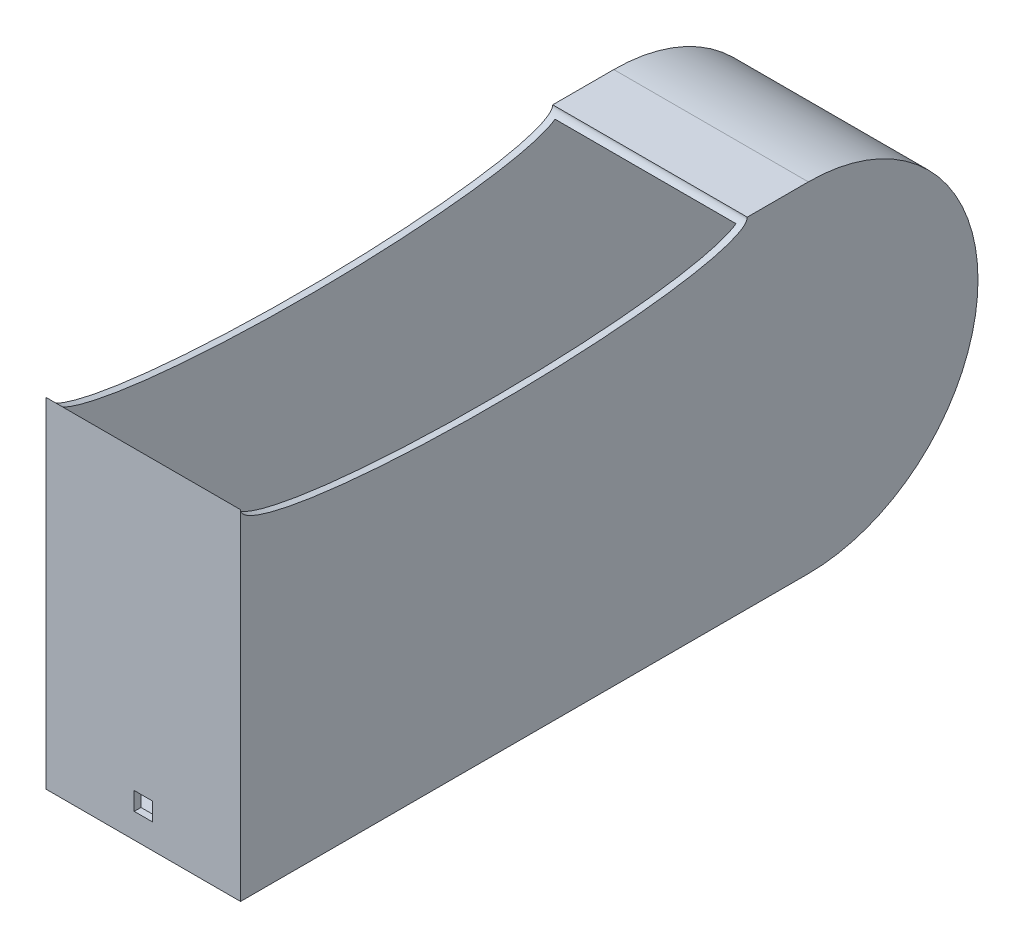
ISO-10303-21;
HEADER;
FILE_DESCRIPTION(('STEP AP214'),'2;1');
FILE_NAME('part.step','',(''),(''),'','','');
FILE_SCHEMA(('AUTOMOTIVE_DESIGN { 1 0 10303 214 1 1 1 1 }'));
ENDSEC;
DATA;
#1=APPLICATION_CONTEXT('core data for automotive mechanical design processes');
#2=APPLICATION_PROTOCOL_DEFINITION('international standard','automotive_design',2000,#1);
#3=PRODUCT_CONTEXT('',#1,'mechanical');
#4=PRODUCT('Part','Part','',(#3));
#5=PRODUCT_RELATED_PRODUCT_CATEGORY('part','',(#4));
#6=PRODUCT_DEFINITION_FORMATION('','',#4);
#7=PRODUCT_DEFINITION_CONTEXT('part definition',#1,'design');
#8=PRODUCT_DEFINITION('design','',#6,#7);
#9=PRODUCT_DEFINITION_SHAPE('','',#8);
#10=(LENGTH_UNIT() NAMED_UNIT(*) SI_UNIT(.MILLI.,.METRE.));
#11=(NAMED_UNIT(*) PLANE_ANGLE_UNIT() SI_UNIT($,.RADIAN.));
#12=(NAMED_UNIT(*) SI_UNIT($,.STERADIAN.) SOLID_ANGLE_UNIT());
#13=UNCERTAINTY_MEASURE_WITH_UNIT(LENGTH_MEASURE(1.E-05),#10,'distance_accuracy_value','');
#14=(GEOMETRIC_REPRESENTATION_CONTEXT(3) GLOBAL_UNCERTAINTY_ASSIGNED_CONTEXT((#13)) GLOBAL_UNIT_ASSIGNED_CONTEXT((#10,
#11,#12)) REPRESENTATION_CONTEXT('',''));
#15=CARTESIAN_POINT('',(0.,0.,0.));
#16=DIRECTION('',(0.,0.,1.));
#17=DIRECTION('',(1.,0.,0.));
#18=AXIS2_PLACEMENT_3D('',#15,#16,#17);
#19=CARTESIAN_POINT('',(-63.5,114.3,0.));
#20=DIRECTION('',(1.,0.,0.));
#21=DIRECTION('',(0.,0.,-1.));
#22=AXIS2_PLACEMENT_3D('',#19,#20,#21);
#23=CYLINDRICAL_SURFACE('',#22,119.0625);
#24=DIRECTION('',(1.,0.,0.));
#25=VECTOR('',#24,1.);
#26=CARTESIAN_POINT('',(-63.5,233.3625,0.));
#27=LINE('',#26,#25);
#28=CARTESIAN_POINT('',(-68.2625,233.3625,0.));
#29=VERTEX_POINT('',#28);
#30=CARTESIAN_POINT('',(68.2625,233.3625,0.));
#31=VERTEX_POINT('',#30);
#32=EDGE_CURVE('E151',#29,#31,#27,.T.);
#33=ORIENTED_EDGE('',*,*,#32,.T.);
#34=CARTESIAN_POINT('',(68.2625,114.3,0.));
#35=DIRECTION('',(1.,0.,0.));
#36=DIRECTION('',(0.,0.,-1.));
#37=AXIS2_PLACEMENT_3D('',#34,#35,#36);
#38=CIRCLE('',#37,119.0625);
#39=CARTESIAN_POINT('',(68.2625,-4.76249999999989,0.));
#40=VERTEX_POINT('',#39);
#41=EDGE_CURVE('E172',#40,#31,#38,.T.);
#42=ORIENTED_EDGE('',*,*,#41,.F.);
#43=DIRECTION('',(1.,0.,0.));
#44=VECTOR('',#43,1.);
#45=CARTESIAN_POINT('',(-63.5,-4.7625,0.));
#46=LINE('',#45,#44);
#47=CARTESIAN_POINT('',(-68.2625,-4.76249999999989,0.));
#48=VERTEX_POINT('',#47);
#49=EDGE_CURVE('E45',#48,#40,#46,.T.);
#50=ORIENTED_EDGE('',*,*,#49,.F.);
#51=CARTESIAN_POINT('',(-68.2625,114.3,0.));
#52=DIRECTION('',(1.,0.,0.));
#53=DIRECTION('',(0.,0.,-1.));
#54=AXIS2_PLACEMENT_3D('',#51,#52,#53);
#55=CIRCLE('',#54,119.0625);
#56=EDGE_CURVE('E159',#48,#29,#55,.T.);
#57=ORIENTED_EDGE('',*,*,#56,.T.);
#58=EDGE_LOOP('',(#33,#42,#50,#57));
#59=FACE_BOUND('',#58,.T.);
#60=ADVANCED_FACE('F38',(#59),#23,.T.);
#61=CARTESIAN_POINT('',(-63.5,-4.7625,0.));
#62=DIRECTION('',(0.,-1.,0.));
#63=DIRECTION('',(0.,0.,-1.));
#64=AXIS2_PLACEMENT_3D('',#61,#62,#63);
#65=PLANE('',#64);
#66=ORIENTED_EDGE('',*,*,#49,.T.);
#67=DIRECTION('',(0.,0.,-1.));
#68=VECTOR('',#67,1.);
#69=CARTESIAN_POINT('',(68.2625,-4.76249999999989,398.4625));
#70=LINE('',#69,#68);
#71=CARTESIAN_POINT('',(68.2625,-4.76249999999989,398.4625));
#72=VERTEX_POINT('',#71);
#73=EDGE_CURVE('E169',#72,#40,#70,.T.);
#74=ORIENTED_EDGE('',*,*,#73,.F.);
#75=DIRECTION('',(1.,0.,0.));
#76=VECTOR('',#75,1.);
#77=CARTESIAN_POINT('',(-63.5,-4.76250000000005,398.4625));
#78=LINE('',#77,#76);
#79=CARTESIAN_POINT('',(-68.2625,-4.76249999999989,398.4625));
#80=VERTEX_POINT('',#79);
#81=EDGE_CURVE('E150',#80,#72,#78,.T.);
#82=ORIENTED_EDGE('',*,*,#81,.F.);
#83=DIRECTION('',(0.,0.,-1.));
#84=VECTOR('',#83,1.);
#85=CARTESIAN_POINT('',(-68.2625,-4.76249999999989,398.4625));
#86=LINE('',#85,#84);
#87=EDGE_CURVE('E156',#80,#48,#86,.T.);
#88=ORIENTED_EDGE('',*,*,#87,.T.);
#89=EDGE_LOOP('',(#66,#74,#82,#88));
#90=FACE_BOUND('',#89,.T.);
#91=ADVANCED_FACE('F250',(#90),#65,.T.);
#92=CARTESIAN_POINT('',(-63.5,-4.76250000000005,398.4625));
#93=DIRECTION('',(0.,0.,1.));
#94=DIRECTION('',(1.,0.,0.));
#95=AXIS2_PLACEMENT_3D('',#92,#93,#94);
#96=PLANE('',#95);
#97=DIRECTION('',(1.,0.,0.));
#98=VECTOR('',#97,1.);
#99=CARTESIAN_POINT('',(-6.35,12.7,398.4625));
#100=LINE('',#99,#98);
#101=CARTESIAN_POINT('',(-6.35,12.7,398.4625));
#102=VERTEX_POINT('',#101);
#103=CARTESIAN_POINT('',(6.35,12.7,398.4625));
#104=VERTEX_POINT('',#103);
#105=EDGE_CURVE('E187',#102,#104,#100,.T.);
#106=ORIENTED_EDGE('',*,*,#105,.F.);
#107=DIRECTION('',(0.,-1.,0.));
#108=VECTOR('',#107,1.);
#109=CARTESIAN_POINT('',(-6.35,25.4,398.4625));
#110=LINE('',#109,#108);
#111=CARTESIAN_POINT('',(-6.35,25.4,398.4625));
#112=VERTEX_POINT('',#111);
#113=EDGE_CURVE('E190',#112,#102,#110,.T.);
#114=ORIENTED_EDGE('',*,*,#113,.F.);
#115=DIRECTION('',(-1.,0.,0.));
#116=VECTOR('',#115,1.);
#117=CARTESIAN_POINT('',(-6.35,25.4,398.4625));
#118=LINE('',#117,#116);
#119=CARTESIAN_POINT('',(6.35,25.4,398.4625));
#120=VERTEX_POINT('',#119);
#121=EDGE_CURVE('E181',#120,#112,#118,.T.);
#122=ORIENTED_EDGE('',*,*,#121,.F.);
#123=DIRECTION('',(0.,1.,0.));
#124=VECTOR('',#123,1.);
#125=CARTESIAN_POINT('',(6.35,25.4,398.4625));
#126=LINE('',#125,#124);
#127=EDGE_CURVE('E184',#104,#120,#126,.T.);
#128=ORIENTED_EDGE('',*,*,#127,.F.);
#129=EDGE_LOOP('',(#106,#114,#122,#128));
#130=FACE_BOUND('',#129,.T.);
#131=ORIENTED_EDGE('',*,*,#81,.T.);
#132=DIRECTION('',(0.,-1.,0.));
#133=VECTOR('',#132,1.);
#134=CARTESIAN_POINT('',(68.2625,233.3625,398.4625));
#135=LINE('',#134,#133);
#136=CARTESIAN_POINT('',(68.2625,233.3625,398.4625));
#137=VERTEX_POINT('',#136);
#138=EDGE_CURVE('E149',#137,#72,#135,.T.);
#139=ORIENTED_EDGE('',*,*,#138,.F.);
#140=DIRECTION('',(1.,0.,0.));
#141=VECTOR('',#140,1.);
#142=CARTESIAN_POINT('',(-63.5,233.3625,398.4625));
#143=LINE('',#142,#141);
#144=CARTESIAN_POINT('',(-68.2625,233.3625,398.4625));
#145=VERTEX_POINT('',#144);
#146=EDGE_CURVE('E136',#145,#137,#143,.T.);
#147=ORIENTED_EDGE('',*,*,#146,.F.);
#148=DIRECTION('',(0.,-1.,0.));
#149=VECTOR('',#148,1.);
#150=CARTESIAN_POINT('',(-68.2625,233.3625,398.4625));
#151=LINE('',#150,#149);
#152=EDGE_CURVE('E146',#145,#80,#151,.T.);
#153=ORIENTED_EDGE('',*,*,#152,.T.);
#154=EDGE_LOOP('',(#131,#139,#147,#153));
#155=FACE_BOUND('',#154,.T.);
#156=ADVANCED_FACE('F145',(#130,#155),#96,.T.);
#157=CARTESIAN_POINT('',(-63.5,233.3625,398.4625));
#158=DIRECTION('',(0.,1.,0.));
#159=DIRECTION('',(0.,0.,1.));
#160=AXIS2_PLACEMENT_3D('',#157,#158,#159);
#161=PLANE('',#160);
#162=DIRECTION('',(1.,0.,0.));
#163=VECTOR('',#162,1.);
#164=CARTESIAN_POINT('',(-68.2625,233.3625,42.8625));
#165=LINE('',#164,#163);
#166=CARTESIAN_POINT('',(68.2625,233.3625,42.8625));
#167=VERTEX_POINT('',#166);
#168=CARTESIAN_POINT('',(-68.2625,233.3625,42.8625000000001));
#169=VERTEX_POINT('',#168);
#170=EDGE_CURVE('E59',#167,#169,#165,.F.);
#171=ORIENTED_EDGE('',*,*,#170,.F.);
#172=DIRECTION('',(0.,0.,1.));
#173=VECTOR('',#172,1.);
#174=CARTESIAN_POINT('',(68.2625,233.3625,398.4625));
#175=LINE('',#174,#173);
#176=EDGE_CURVE('E175',#31,#167,#175,.T.);
#177=ORIENTED_EDGE('',*,*,#176,.F.);
#178=ORIENTED_EDGE('',*,*,#32,.F.);
#179=DIRECTION('',(0.,0.,1.));
#180=VECTOR('',#179,1.);
#181=CARTESIAN_POINT('',(-68.2625,233.3625,398.4625));
#182=LINE('',#181,#180);
#183=EDGE_CURVE('E157',#29,#169,#182,.T.);
#184=ORIENTED_EDGE('',*,*,#183,.T.);
#185=EDGE_LOOP('',(#171,#177,#178,#184));
#186=FACE_BOUND('',#185,.T.);
#187=ADVANCED_FACE('F248',(#186),#161,.T.);
#188=CARTESIAN_POINT('',(-63.5,114.3,0.));
#189=DIRECTION('',(1.,0.,0.));
#190=DIRECTION('',(0.,0.,-1.));
#191=AXIS2_PLACEMENT_3D('',#188,#189,#190);
#192=CYLINDRICAL_SURFACE('',#191,114.3);
#193=DIRECTION('',(1.,0.,0.));
#194=VECTOR('',#193,1.);
#195=CARTESIAN_POINT('',(-63.5,0.,0.));
#196=LINE('',#195,#194);
#197=CARTESIAN_POINT('',(-63.5,0.,0.));
#198=VERTEX_POINT('',#197);
#199=CARTESIAN_POINT('',(63.5,0.,0.));
#200=VERTEX_POINT('',#199);
#201=EDGE_CURVE('E232',#198,#200,#196,.T.);
#202=ORIENTED_EDGE('',*,*,#201,.T.);
#203=CARTESIAN_POINT('',(63.5,114.3,0.));
#204=DIRECTION('',(1.,0.,0.));
#205=DIRECTION('',(0.,0.,-1.));
#206=AXIS2_PLACEMENT_3D('',#203,#204,#205);
#207=CIRCLE('',#206,114.3);
#208=CARTESIAN_POINT('',(63.5,228.6,0.));
#209=VERTEX_POINT('',#208);
#210=EDGE_CURVE('E209',#200,#209,#207,.T.);
#211=ORIENTED_EDGE('',*,*,#210,.T.);
#212=DIRECTION('',(1.,0.,0.));
#213=VECTOR('',#212,1.);
#214=CARTESIAN_POINT('',(-63.5,228.6,0.));
#215=LINE('',#214,#213);
#216=CARTESIAN_POINT('',(-63.5,228.6,0.));
#217=VERTEX_POINT('',#216);
#218=EDGE_CURVE('E231',#217,#209,#215,.T.);
#219=ORIENTED_EDGE('',*,*,#218,.F.);
#220=CARTESIAN_POINT('',(-63.5,114.3,0.));
#221=DIRECTION('',(1.,0.,0.));
#222=DIRECTION('',(0.,0.,-1.));
#223=AXIS2_PLACEMENT_3D('',#220,#221,#222);
#224=CIRCLE('',#223,114.3);
#225=EDGE_CURVE('E220',#198,#217,#224,.T.);
#226=ORIENTED_EDGE('',*,*,#225,.F.);
#227=EDGE_LOOP('',(#202,#211,#219,#226));
#228=FACE_BOUND('',#227,.T.);
#229=ADVANCED_FACE('F295',(#228),#192,.F.);
#230=CARTESIAN_POINT('',(-63.5,0.,0.));
#231=DIRECTION('',(0.,-1.,0.));
#232=DIRECTION('',(0.,0.,-1.));
#233=AXIS2_PLACEMENT_3D('',#230,#231,#232);
#234=PLANE('',#233);
#235=DIRECTION('',(1.,0.,0.));
#236=VECTOR('',#235,1.);
#237=CARTESIAN_POINT('',(-63.5,0.,393.7));
#238=LINE('',#237,#236);
#239=CARTESIAN_POINT('',(-63.5,0.,393.7));
#240=VERTEX_POINT('',#239);
#241=CARTESIAN_POINT('',(63.5,0.,393.7));
#242=VERTEX_POINT('',#241);
#243=EDGE_CURVE('E235',#240,#242,#238,.T.);
#244=ORIENTED_EDGE('',*,*,#243,.T.);
#245=DIRECTION('',(0.,0.,-1.));
#246=VECTOR('',#245,1.);
#247=CARTESIAN_POINT('',(63.5,0.,0.));
#248=LINE('',#247,#246);
#249=EDGE_CURVE('E217',#242,#200,#248,.T.);
#250=ORIENTED_EDGE('',*,*,#249,.T.);
#251=ORIENTED_EDGE('',*,*,#201,.F.);
#252=DIRECTION('',(0.,0.,-1.));
#253=VECTOR('',#252,1.);
#254=CARTESIAN_POINT('',(-63.5,0.,0.));
#255=LINE('',#254,#253);
#256=EDGE_CURVE('E228',#240,#198,#255,.T.);
#257=ORIENTED_EDGE('',*,*,#256,.F.);
#258=EDGE_LOOP('',(#244,#250,#251,#257));
#259=FACE_BOUND('',#258,.T.);
#260=ADVANCED_FACE('F291',(#259),#234,.F.);
#261=CARTESIAN_POINT('',(-63.5,0.,393.7));
#262=DIRECTION('',(0.,0.,1.));
#263=DIRECTION('',(1.,0.,0.));
#264=AXIS2_PLACEMENT_3D('',#261,#262,#263);
#265=PLANE('',#264);
#266=DIRECTION('',(0.,1.,0.));
#267=VECTOR('',#266,1.);
#268=CARTESIAN_POINT('',(-6.35,25.4,393.7));
#269=LINE('',#268,#267);
#270=CARTESIAN_POINT('',(-6.35,12.7,393.7));
#271=VERTEX_POINT('',#270);
#272=CARTESIAN_POINT('',(-6.35,25.4,393.7));
#273=VERTEX_POINT('',#272);
#274=EDGE_CURVE('E180',#271,#273,#269,.T.);
#275=ORIENTED_EDGE('',*,*,#274,.F.);
#276=DIRECTION('',(-1.,0.,0.));
#277=VECTOR('',#276,1.);
#278=CARTESIAN_POINT('',(-6.35,12.7,393.7));
#279=LINE('',#278,#277);
#280=CARTESIAN_POINT('',(6.35,12.7,393.7));
#281=VERTEX_POINT('',#280);
#282=EDGE_CURVE('E178',#281,#271,#279,.T.);
#283=ORIENTED_EDGE('',*,*,#282,.F.);
#284=DIRECTION('',(0.,-1.,0.));
#285=VECTOR('',#284,1.);
#286=CARTESIAN_POINT('',(6.35,25.4,393.7));
#287=LINE('',#286,#285);
#288=CARTESIAN_POINT('',(6.35,25.4,393.7));
#289=VERTEX_POINT('',#288);
#290=EDGE_CURVE('E193',#289,#281,#287,.T.);
#291=ORIENTED_EDGE('',*,*,#290,.F.);
#292=DIRECTION('',(1.,0.,0.));
#293=VECTOR('',#292,1.);
#294=CARTESIAN_POINT('',(-6.35,25.4,393.7));
#295=LINE('',#294,#293);
#296=EDGE_CURVE('E196',#273,#289,#295,.T.);
#297=ORIENTED_EDGE('',*,*,#296,.F.);
#298=EDGE_LOOP('',(#275,#283,#291,#297));
#299=FACE_BOUND('',#298,.T.);
#300=DIRECTION('',(0.,-1.,0.));
#301=VECTOR('',#300,1.);
#302=CARTESIAN_POINT('',(-63.5,0.,393.7));
#303=LINE('',#302,#301);
#304=CARTESIAN_POINT('',(-63.5,227.52304308901,393.7));
#305=VERTEX_POINT('',#304);
#306=EDGE_CURVE('E226',#305,#240,#303,.T.);
#307=ORIENTED_EDGE('',*,*,#306,.F.);
#308=DIRECTION('',(1.,0.,0.));
#309=VECTOR('',#308,1.);
#310=CARTESIAN_POINT('',(-68.2625,227.52304308901,393.7));
#311=LINE('',#310,#309);
#312=CARTESIAN_POINT('',(63.5,227.52304308901,393.7));
#313=VERTEX_POINT('',#312);
#314=EDGE_CURVE('E52',#305,#313,#311,.T.);
#315=ORIENTED_EDGE('',*,*,#314,.T.);
#316=DIRECTION('',(0.,-1.,0.));
#317=VECTOR('',#316,1.);
#318=CARTESIAN_POINT('',(63.5,0.,393.7));
#319=LINE('',#318,#317);
#320=EDGE_CURVE('E215',#313,#242,#319,.T.);
#321=ORIENTED_EDGE('',*,*,#320,.T.);
#322=ORIENTED_EDGE('',*,*,#243,.F.);
#323=EDGE_LOOP('',(#307,#315,#321,#322));
#324=FACE_BOUND('',#323,.T.);
#325=ADVANCED_FACE('F294',(#299,#324),#265,.F.);
#326=CARTESIAN_POINT('',(-63.5,228.6,393.7));
#327=DIRECTION('',(0.,1.,0.));
#328=DIRECTION('',(0.,0.,1.));
#329=AXIS2_PLACEMENT_3D('',#326,#327,#328);
#330=PLANE('',#329);
#331=DIRECTION('',(0.,0.,1.));
#332=VECTOR('',#331,1.);
#333=CARTESIAN_POINT('',(63.5,228.6,393.7));
#334=LINE('',#333,#332);
#335=CARTESIAN_POINT('',(63.5,228.6,46.0158536143621));
#336=VERTEX_POINT('',#335);
#337=EDGE_CURVE('E212',#209,#336,#334,.T.);
#338=ORIENTED_EDGE('',*,*,#337,.T.);
#339=DIRECTION('',(1.,0.,0.));
#340=VECTOR('',#339,1.);
#341=CARTESIAN_POINT('',(-68.2625,228.6,46.0158536143621));
#342=LINE('',#341,#340);
#343=CARTESIAN_POINT('',(-63.5,228.6,46.0158536143621));
#344=VERTEX_POINT('',#343);
#345=EDGE_CURVE('E254',#336,#344,#342,.F.);
#346=ORIENTED_EDGE('',*,*,#345,.T.);
#347=DIRECTION('',(0.,0.,1.));
#348=VECTOR('',#347,1.);
#349=CARTESIAN_POINT('',(-63.5,228.6,393.7));
#350=LINE('',#349,#348);
#351=EDGE_CURVE('E223',#217,#344,#350,.T.);
#352=ORIENTED_EDGE('',*,*,#351,.F.);
#353=ORIENTED_EDGE('',*,*,#218,.T.);
#354=EDGE_LOOP('',(#338,#346,#352,#353));
#355=FACE_BOUND('',#354,.T.);
#356=ADVANCED_FACE('F289',(#355),#330,.F.);
#357=CARTESIAN_POINT('',(-6.35,12.7,-119.0635));
#358=DIRECTION('',(0.,-1.,0.));
#359=DIRECTION('',(0.,0.,-1.));
#360=AXIS2_PLACEMENT_3D('',#357,#358,#359);
#361=PLANE('',#360);
#362=ORIENTED_EDGE('',*,*,#282,.T.);
#363=DIRECTION('',(0.,0.,1.));
#364=VECTOR('',#363,1.);
#365=CARTESIAN_POINT('',(-6.35,12.7,-119.0635));
#366=LINE('',#365,#364);
#367=EDGE_CURVE('E204',#271,#102,#366,.T.);
#368=ORIENTED_EDGE('',*,*,#367,.T.);
#369=ORIENTED_EDGE('',*,*,#105,.T.);
#370=DIRECTION('',(0.,0.,1.));
#371=VECTOR('',#370,1.);
#372=CARTESIAN_POINT('',(6.35,12.7,-119.0635));
#373=LINE('',#372,#371);
#374=EDGE_CURVE('E183',#281,#104,#373,.T.);
#375=ORIENTED_EDGE('',*,*,#374,.F.);
#376=EDGE_LOOP('',(#362,#368,#369,#375));
#377=FACE_BOUND('',#376,.T.);
#378=ADVANCED_FACE('F285',(#377),#361,.F.);
#379=CARTESIAN_POINT('',(6.35,25.4,-119.0635));
#380=DIRECTION('',(1.,0.,0.));
#381=DIRECTION('',(0.,1.,0.));
#382=AXIS2_PLACEMENT_3D('',#379,#380,#381);
#383=PLANE('',#382);
#384=ORIENTED_EDGE('',*,*,#290,.T.);
#385=ORIENTED_EDGE('',*,*,#374,.T.);
#386=ORIENTED_EDGE('',*,*,#127,.T.);
#387=DIRECTION('',(0.,0.,1.));
#388=VECTOR('',#387,1.);
#389=CARTESIAN_POINT('',(6.35,25.4,-119.0635));
#390=LINE('',#389,#388);
#391=EDGE_CURVE('E205',#289,#120,#390,.T.);
#392=ORIENTED_EDGE('',*,*,#391,.F.);
#393=EDGE_LOOP('',(#384,#385,#386,#392));
#394=FACE_BOUND('',#393,.T.);
#395=ADVANCED_FACE('F281',(#394),#383,.F.);
#396=CARTESIAN_POINT('',(-6.35,25.4,-119.0635));
#397=DIRECTION('',(0.,1.,0.));
#398=DIRECTION('',(0.,0.,1.));
#399=AXIS2_PLACEMENT_3D('',#396,#397,#398);
#400=PLANE('',#399);
#401=ORIENTED_EDGE('',*,*,#296,.T.);
#402=ORIENTED_EDGE('',*,*,#391,.T.);
#403=ORIENTED_EDGE('',*,*,#121,.T.);
#404=DIRECTION('',(0.,0.,1.));
#405=VECTOR('',#404,1.);
#406=CARTESIAN_POINT('',(-6.35,25.4,-119.0635));
#407=LINE('',#406,#405);
#408=EDGE_CURVE('E201',#273,#112,#407,.T.);
#409=ORIENTED_EDGE('',*,*,#408,.F.);
#410=EDGE_LOOP('',(#401,#402,#403,#409));
#411=FACE_BOUND('',#410,.T.);
#412=ADVANCED_FACE('F277',(#411),#400,.F.);
#413=CARTESIAN_POINT('',(-6.35,25.4,-119.0635));
#414=DIRECTION('',(-1.,0.,0.));
#415=DIRECTION('',(0.,-1.,0.));
#416=AXIS2_PLACEMENT_3D('',#413,#414,#415);
#417=PLANE('',#416);
#418=ORIENTED_EDGE('',*,*,#274,.T.);
#419=ORIENTED_EDGE('',*,*,#408,.T.);
#420=ORIENTED_EDGE('',*,*,#113,.T.);
#421=ORIENTED_EDGE('',*,*,#367,.F.);
#422=EDGE_LOOP('',(#418,#419,#420,#421));
#423=FACE_BOUND('',#422,.T.);
#424=ADVANCED_FACE('F273',(#423),#417,.F.);
#425=CARTESIAN_POINT('',(63.5,114.3,0.));
#426=DIRECTION('',(1.,0.,0.));
#427=DIRECTION('',(0.,0.,-1.));
#428=AXIS2_PLACEMENT_3D('',#425,#426,#427);
#429=PLANE('',#428);
#430=ORIENTED_EDGE('',*,*,#320,.F.);
#431=CARTESIAN_POINT('',(63.5,233.3625,220.6625));
#432=DIRECTION('',(1.,0.,0.));
#433=DIRECTION('',(0.,0.,-1.));
#434=AXIS2_PLACEMENT_3D('',#431,#432,#433);
#435=ELLIPSE('',#434,177.8,25.3999999999999);
#436=EDGE_CURVE('E161',#313,#336,#435,.T.);
#437=ORIENTED_EDGE('',*,*,#436,.T.);
#438=ORIENTED_EDGE('',*,*,#337,.F.);
#439=ORIENTED_EDGE('',*,*,#210,.F.);
#440=ORIENTED_EDGE('',*,*,#249,.F.);
#441=EDGE_LOOP('',(#430,#437,#438,#439,#440));
#442=FACE_BOUND('',#441,.T.);
#443=ADVANCED_FACE('F270',(#442),#429,.F.);
#444=CARTESIAN_POINT('',(68.2625,114.3,0.));
#445=DIRECTION('',(1.,0.,0.));
#446=DIRECTION('',(0.,0.,-1.));
#447=AXIS2_PLACEMENT_3D('',#444,#445,#446);
#448=PLANE('',#447);
#449=CARTESIAN_POINT('',(68.2625,233.3625,220.6625));
#450=DIRECTION('',(1.,0.,0.));
#451=DIRECTION('',(0.,0.,-1.));
#452=AXIS2_PLACEMENT_3D('',#449,#450,#451);
#453=ELLIPSE('',#452,177.8,25.3999999999999);
#454=EDGE_CURVE('E251',#137,#167,#453,.T.);
#455=ORIENTED_EDGE('',*,*,#454,.F.);
#456=ORIENTED_EDGE('',*,*,#138,.T.);
#457=ORIENTED_EDGE('',*,*,#73,.T.);
#458=ORIENTED_EDGE('',*,*,#41,.T.);
#459=ORIENTED_EDGE('',*,*,#176,.T.);
#460=EDGE_LOOP('',(#455,#456,#457,#458,#459));
#461=FACE_BOUND('',#460,.T.);
#462=ADVANCED_FACE('F246',(#461),#448,.T.);
#463=CARTESIAN_POINT('',(-63.5,114.3,0.));
#464=DIRECTION('',(-1.,0.,0.));
#465=DIRECTION('',(0.,0.,-1.));
#466=AXIS2_PLACEMENT_3D('',#463,#464,#465);
#467=PLANE('',#466);
#468=ORIENTED_EDGE('',*,*,#351,.T.);
#469=CARTESIAN_POINT('',(-63.5,233.3625,220.6625));
#470=DIRECTION('',(1.,0.,0.));
#471=DIRECTION('',(0.,0.,-1.));
#472=AXIS2_PLACEMENT_3D('',#469,#470,#471);
#473=ELLIPSE('',#472,177.8,25.3999999999999);
#474=EDGE_CURVE('E252',#344,#305,#473,.F.);
#475=ORIENTED_EDGE('',*,*,#474,.T.);
#476=ORIENTED_EDGE('',*,*,#306,.T.);
#477=ORIENTED_EDGE('',*,*,#256,.T.);
#478=ORIENTED_EDGE('',*,*,#225,.T.);
#479=EDGE_LOOP('',(#468,#475,#476,#477,#478));
#480=FACE_BOUND('',#479,.T.);
#481=ADVANCED_FACE('F264',(#480),#467,.F.);
#482=CARTESIAN_POINT('',(-68.2625,114.3,0.));
#483=DIRECTION('',(-1.,0.,0.));
#484=DIRECTION('',(0.,0.,-1.));
#485=AXIS2_PLACEMENT_3D('',#482,#483,#484);
#486=PLANE('',#485);
#487=CARTESIAN_POINT('',(-68.2625,233.3625,220.6625));
#488=DIRECTION('',(1.,0.,0.));
#489=DIRECTION('',(0.,0.,-1.));
#490=AXIS2_PLACEMENT_3D('',#487,#488,#489);
#491=ELLIPSE('',#490,177.8,25.3999999999999);
#492=EDGE_CURVE('E11',#169,#145,#491,.F.);
#493=ORIENTED_EDGE('',*,*,#492,.F.);
#494=ORIENTED_EDGE('',*,*,#183,.F.);
#495=ORIENTED_EDGE('',*,*,#56,.F.);
#496=ORIENTED_EDGE('',*,*,#87,.F.);
#497=ORIENTED_EDGE('',*,*,#152,.F.);
#498=EDGE_LOOP('',(#493,#494,#495,#496,#497));
#499=FACE_BOUND('',#498,.T.);
#500=ADVANCED_FACE('F153',(#499),#486,.T.);
#501=CARTESIAN_POINT('',(-68.2625,233.3625,220.6625));
#502=DIRECTION('',(1.,0.,0.));
#503=DIRECTION('',(0.,0.,-1.));
#504=AXIS2_PLACEMENT_3D('',#501,#502,#503);
#505=ELLIPSE('',#504,177.8,25.3999999999999);
#506=DIRECTION('',(1.,0.,0.));
#507=VECTOR('',#506,1.);
#508=SURFACE_OF_LINEAR_EXTRUSION('',#505,#507);
#509=ORIENTED_EDGE('',*,*,#146,.T.);
#510=ORIENTED_EDGE('',*,*,#454,.T.);
#511=ORIENTED_EDGE('',*,*,#170,.T.);
#512=ORIENTED_EDGE('',*,*,#492,.T.);
#513=EDGE_LOOP('',(#509,#510,#511,#512));
#514=FACE_BOUND('',#513,.T.);
#515=ORIENTED_EDGE('',*,*,#314,.F.);
#516=ORIENTED_EDGE('',*,*,#474,.F.);
#517=ORIENTED_EDGE('',*,*,#345,.F.);
#518=ORIENTED_EDGE('',*,*,#436,.F.);
#519=EDGE_LOOP('',(#515,#516,#517,#518));
#520=FACE_BOUND('',#519,.T.);
#521=ADVANCED_FACE('F135',(#514,#520),#508,.F.);
#522=CLOSED_SHELL('',(#60,#91,#156,#187,#229,#260,#325,#356,#378,#395,#412,#424,#443,#462,#481,
#500,#521));
#523=MANIFOLD_SOLID_BREP('B2',#522);
#524=ADVANCED_BREP_SHAPE_REPRESENTATION('',(#18,#523),#14);
#525=SHAPE_DEFINITION_REPRESENTATION(#9,#524);
ENDSEC;
END-ISO-10303-21;
